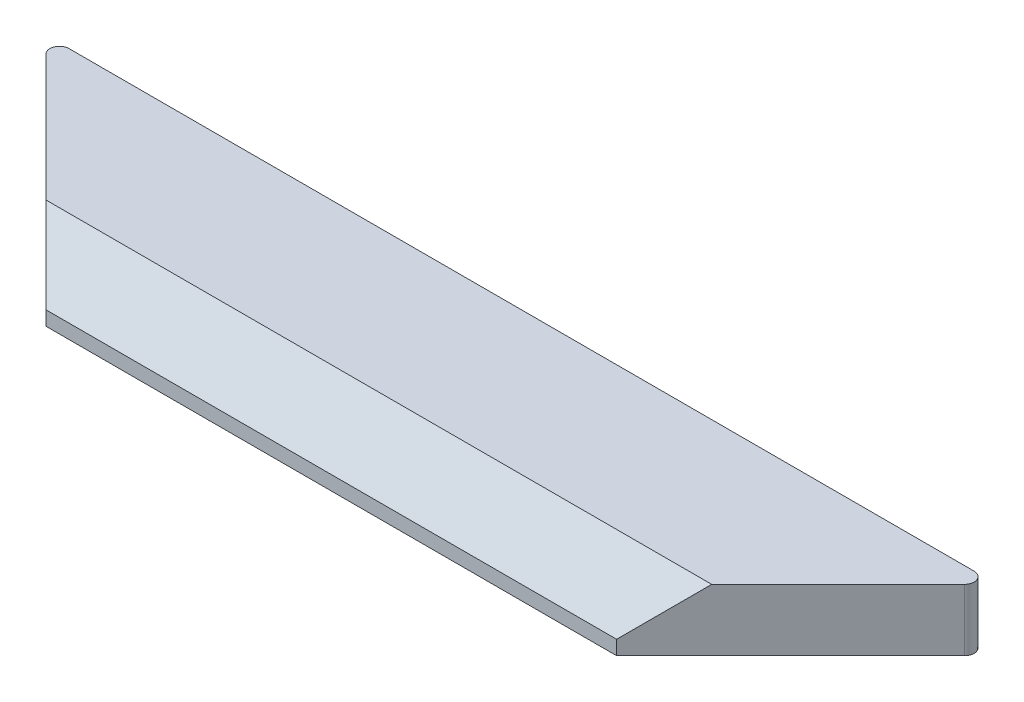
ISO-10303-21;
HEADER;
FILE_DESCRIPTION(('STEP AP214'),'2;1');
FILE_NAME('part.step','',(''),(''),'','','');
FILE_SCHEMA(('AUTOMOTIVE_DESIGN { 1 0 10303 214 1 1 1 1 }'));
ENDSEC;
DATA;
#1=APPLICATION_CONTEXT('core data for automotive mechanical design processes');
#2=APPLICATION_PROTOCOL_DEFINITION('international standard','automotive_design',2000,#1);
#3=PRODUCT_CONTEXT('',#1,'mechanical');
#4=PRODUCT('Part','Part','',(#3));
#5=PRODUCT_RELATED_PRODUCT_CATEGORY('part','',(#4));
#6=PRODUCT_DEFINITION_FORMATION('','',#4);
#7=PRODUCT_DEFINITION_CONTEXT('part definition',#1,'design');
#8=PRODUCT_DEFINITION('design','',#6,#7);
#9=PRODUCT_DEFINITION_SHAPE('','',#8);
#10=(LENGTH_UNIT() NAMED_UNIT(*) SI_UNIT(.MILLI.,.METRE.));
#11=(NAMED_UNIT(*) PLANE_ANGLE_UNIT() SI_UNIT($,.RADIAN.));
#12=(NAMED_UNIT(*) SI_UNIT($,.STERADIAN.) SOLID_ANGLE_UNIT());
#13=UNCERTAINTY_MEASURE_WITH_UNIT(LENGTH_MEASURE(1.E-05),#10,'distance_accuracy_value','');
#14=(GEOMETRIC_REPRESENTATION_CONTEXT(3) GLOBAL_UNCERTAINTY_ASSIGNED_CONTEXT((#13)) GLOBAL_UNIT_ASSIGNED_CONTEXT((#10,
#11,#12)) REPRESENTATION_CONTEXT('',''));
#15=CARTESIAN_POINT('',(0.,0.,0.));
#16=DIRECTION('',(0.,0.,1.));
#17=DIRECTION('',(1.,0.,0.));
#18=AXIS2_PLACEMENT_3D('',#15,#16,#17);
#19=CARTESIAN_POINT('',(50.,3.25,-10.));
#20=DIRECTION('',(-0.707106781186548,0.,-0.707106781186546));
#21=DIRECTION('',(-0.707106781186547,0.,0.707106781186549));
#22=AXIS2_PLACEMENT_3D('',#19,#20,#21);
#23=PLANE('',#22);
#24=DIRECTION('',(0.707106781186546,0.,-0.707106781186549));
#25=VECTOR('',#24,1.);
#26=CARTESIAN_POINT('',(50.,-3.25,-10.));
#27=LINE('',#26,#25);
#28=CARTESIAN_POINT('',(30.0000000000001,-3.25,10.));
#29=VERTEX_POINT('',#28);
#30=CARTESIAN_POINT('',(48.2928932188135,-3.25,-8.29289321881346));
#31=VERTEX_POINT('',#30);
#32=EDGE_CURVE('E180',#29,#31,#27,.T.);
#33=ORIENTED_EDGE('',*,*,#32,.T.);
#34=DIRECTION('',(0.,-1.,0.));
#35=VECTOR('',#34,1.);
#36=CARTESIAN_POINT('',(48.2928932188135,3.25,-8.29289321881346));
#37=LINE('',#36,#35);
#38=CARTESIAN_POINT('',(48.2928932188135,3.25,-8.29289321881346));
#39=VERTEX_POINT('',#38);
#40=EDGE_CURVE('E57',#31,#39,#37,.F.);
#41=ORIENTED_EDGE('',*,*,#40,.T.);
#42=DIRECTION('',(0.707106781186546,0.,-0.707106781186549));
#43=VECTOR('',#42,1.);
#44=CARTESIAN_POINT('',(50.,3.25,-10.));
#45=LINE('',#44,#43);
#46=CARTESIAN_POINT('',(35.,3.25,5.));
#47=VERTEX_POINT('',#46);
#48=EDGE_CURVE('E182',#47,#39,#45,.T.);
#49=ORIENTED_EDGE('',*,*,#48,.F.);
#50=DIRECTION('',(-0.577350269189624,-0.577350269189628,0.577350269189626));
#51=VECTOR('',#50,1.);
#52=CARTESIAN_POINT('',(23.3333333333334,-8.41666666666668,16.6666666666666));
#53=LINE('',#52,#51);
#54=CARTESIAN_POINT('',(30.0000000000001,-1.75000000000002,10.));
#55=VERTEX_POINT('',#54);
#56=EDGE_CURVE('E204',#47,#55,#53,.T.);
#57=ORIENTED_EDGE('',*,*,#56,.T.);
#58=DIRECTION('',(0.,-1.,0.));
#59=VECTOR('',#58,1.);
#60=CARTESIAN_POINT('',(30.0000000000001,3.25,10.));
#61=LINE('',#60,#59);
#62=EDGE_CURVE('E176',#55,#29,#61,.T.);
#63=ORIENTED_EDGE('',*,*,#62,.T.);
#64=EDGE_LOOP('',(#33,#41,#49,#57,#63));
#65=FACE_BOUND('',#64,.T.);
#66=ADVANCED_FACE('F41',(#65),#23,.F.);
#67=CARTESIAN_POINT('',(-50.,3.25,-10.));
#68=DIRECTION('',(0.,0.,1.));
#69=DIRECTION('',(1.,0.,0.));
#70=AXIS2_PLACEMENT_3D('',#67,#68,#69);
#71=PLANE('',#70);
#72=DIRECTION('',(-1.,0.,0.));
#73=VECTOR('',#72,1.);
#74=CARTESIAN_POINT('',(-50.,-3.25,-10.));
#75=LINE('',#74,#73);
#76=CARTESIAN_POINT('',(47.5857864376269,-3.25,-10.));
#77=VERTEX_POINT('',#76);
#78=CARTESIAN_POINT('',(31.,-3.25,-10.));
#79=VERTEX_POINT('',#78);
#80=EDGE_CURVE('E165',#77,#79,#75,.T.);
#81=ORIENTED_EDGE('',*,*,#80,.T.);
#82=DIRECTION('',(0.,-1.,0.));
#83=VECTOR('',#82,1.);
#84=CARTESIAN_POINT('',(31.,3.25,-10.));
#85=LINE('',#84,#83);
#86=CARTESIAN_POINT('',(31.,0.75,-10.));
#87=VERTEX_POINT('',#86);
#88=EDGE_CURVE('E262',#79,#87,#85,.F.);
#89=ORIENTED_EDGE('',*,*,#88,.T.);
#90=DIRECTION('',(1.,0.,0.));
#91=VECTOR('',#90,1.);
#92=CARTESIAN_POINT('',(30.,0.75,-10.));
#93=LINE('',#92,#91);
#94=CARTESIAN_POINT('',(-31.,0.75,-10.));
#95=VERTEX_POINT('',#94);
#96=EDGE_CURVE('E289',#95,#87,#93,.T.);
#97=ORIENTED_EDGE('',*,*,#96,.F.);
#98=DIRECTION('',(0.,-1.,0.));
#99=VECTOR('',#98,1.);
#100=CARTESIAN_POINT('',(-31.,3.25,-10.));
#101=LINE('',#100,#99);
#102=CARTESIAN_POINT('',(-31.,-3.25,-10.));
#103=VERTEX_POINT('',#102);
#104=EDGE_CURVE('E258',#95,#103,#101,.T.);
#105=ORIENTED_EDGE('',*,*,#104,.T.);
#106=CARTESIAN_POINT('',(-47.5857864376269,-3.25,-10.));
#107=VERTEX_POINT('',#106);
#108=EDGE_CURVE('E309',#103,#107,#75,.T.);
#109=ORIENTED_EDGE('',*,*,#108,.T.);
#110=DIRECTION('',(0.,-1.,0.));
#111=VECTOR('',#110,1.);
#112=CARTESIAN_POINT('',(-47.5857864376269,3.25,-10.));
#113=LINE('',#112,#111);
#114=CARTESIAN_POINT('',(-47.5857864376269,3.25,-10.));
#115=VERTEX_POINT('',#114);
#116=EDGE_CURVE('E255',#107,#115,#113,.F.);
#117=ORIENTED_EDGE('',*,*,#116,.T.);
#118=DIRECTION('',(-1.,0.,0.));
#119=VECTOR('',#118,1.);
#120=CARTESIAN_POINT('',(-50.,3.25,-10.));
#121=LINE('',#120,#119);
#122=CARTESIAN_POINT('',(47.5857864376269,3.25,-10.));
#123=VERTEX_POINT('',#122);
#124=EDGE_CURVE('E185',#123,#115,#121,.T.);
#125=ORIENTED_EDGE('',*,*,#124,.F.);
#126=DIRECTION('',(0.,-1.,0.));
#127=VECTOR('',#126,1.);
#128=CARTESIAN_POINT('',(47.5857864376269,3.25,-10.));
#129=LINE('',#128,#127);
#130=EDGE_CURVE('E251',#123,#77,#129,.T.);
#131=ORIENTED_EDGE('',*,*,#130,.T.);
#132=EDGE_LOOP('',(#81,#89,#97,#105,#109,#117,#125,#131));
#133=FACE_BOUND('',#132,.T.);
#134=ADVANCED_FACE('F305',(#133),#71,.F.);
#135=CARTESIAN_POINT('',(-50.,3.25,-10.));
#136=DIRECTION('',(0.707106781186549,0.,-0.707106781186546));
#137=DIRECTION('',(-0.707106781186546,0.,-0.707106781186549));
#138=AXIS2_PLACEMENT_3D('',#135,#136,#137);
#139=PLANE('',#138);
#140=DIRECTION('',(0.707106781186546,0.,0.707106781186549));
#141=VECTOR('',#140,1.);
#142=CARTESIAN_POINT('',(-50.,3.25,-10.));
#143=LINE('',#142,#141);
#144=CARTESIAN_POINT('',(-48.2928932188135,3.25,-8.29289321881346));
#145=VERTEX_POINT('',#144);
#146=CARTESIAN_POINT('',(-35.,3.25,5.));
#147=VERTEX_POINT('',#146);
#148=EDGE_CURVE('E190',#145,#147,#143,.T.);
#149=ORIENTED_EDGE('',*,*,#148,.F.);
#150=DIRECTION('',(0.,-1.,0.));
#151=VECTOR('',#150,1.);
#152=CARTESIAN_POINT('',(-48.2928932188135,3.25,-8.29289321881346));
#153=LINE('',#152,#151);
#154=CARTESIAN_POINT('',(-48.2928932188135,-3.25,-8.29289321881346));
#155=VERTEX_POINT('',#154);
#156=EDGE_CURVE('E160',#145,#155,#153,.T.);
#157=ORIENTED_EDGE('',*,*,#156,.T.);
#158=DIRECTION('',(0.707106781186546,0.,0.707106781186549));
#159=VECTOR('',#158,1.);
#160=CARTESIAN_POINT('',(-50.,-3.25,-10.));
#161=LINE('',#160,#159);
#162=CARTESIAN_POINT('',(-30.0000000000001,-3.25,10.));
#163=VERTEX_POINT('',#162);
#164=EDGE_CURVE('E153',#155,#163,#161,.T.);
#165=ORIENTED_EDGE('',*,*,#164,.T.);
#166=DIRECTION('',(0.,-1.,0.));
#167=VECTOR('',#166,1.);
#168=CARTESIAN_POINT('',(-30.0000000000001,3.25,10.));
#169=LINE('',#168,#167);
#170=CARTESIAN_POINT('',(-30.0000000000001,-1.75000000000002,10.));
#171=VERTEX_POINT('',#170);
#172=EDGE_CURVE('E157',#171,#163,#169,.T.);
#173=ORIENTED_EDGE('',*,*,#172,.F.);
#174=DIRECTION('',(-0.577350269189624,0.577350269189628,-0.577350269189626));
#175=VECTOR('',#174,1.);
#176=CARTESIAN_POINT('',(-23.3333333333334,-8.41666666666668,16.6666666666666));
#177=LINE('',#176,#175);
#178=EDGE_CURVE('E209',#171,#147,#177,.T.);
#179=ORIENTED_EDGE('',*,*,#178,.T.);
#180=EDGE_LOOP('',(#149,#157,#165,#173,#179));
#181=FACE_BOUND('',#180,.T.);
#182=ADVANCED_FACE('F155',(#181),#139,.F.);
#183=CARTESIAN_POINT('',(-30.0000000000001,3.25,10.));
#184=DIRECTION('',(0.,0.,-1.));
#185=DIRECTION('',(-1.,0.,0.));
#186=AXIS2_PLACEMENT_3D('',#183,#184,#185);
#187=PLANE('',#186);
#188=ORIENTED_EDGE('',*,*,#62,.F.);
#189=DIRECTION('',(-1.,0.,0.));
#190=VECTOR('',#189,1.);
#191=CARTESIAN_POINT('',(-30.0000000000001,-1.75000000000002,10.));
#192=LINE('',#191,#190);
#193=EDGE_CURVE('E173',#55,#171,#192,.T.);
#194=ORIENTED_EDGE('',*,*,#193,.T.);
#195=ORIENTED_EDGE('',*,*,#172,.T.);
#196=DIRECTION('',(1.,0.,0.));
#197=VECTOR('',#196,1.);
#198=CARTESIAN_POINT('',(-30.0000000000001,-3.25,10.));
#199=LINE('',#198,#197);
#200=EDGE_CURVE('E164',#163,#29,#199,.T.);
#201=ORIENTED_EDGE('',*,*,#200,.T.);
#202=EDGE_LOOP('',(#188,#194,#195,#201));
#203=FACE_BOUND('',#202,.T.);
#204=ADVANCED_FACE('F170',(#203),#187,.F.);
#205=CARTESIAN_POINT('',(0.,3.25,0.));
#206=DIRECTION('',(0.,1.,0.));
#207=DIRECTION('',(0.,0.,1.));
#208=AXIS2_PLACEMENT_3D('',#205,#206,#207);
#209=PLANE('',#208);
#210=ORIENTED_EDGE('',*,*,#124,.T.);
#211=CARTESIAN_POINT('',(-47.5857864376269,3.25,-9.));
#212=DIRECTION('',(0.,1.,0.));
#213=DIRECTION('',(0.,0.,1.));
#214=AXIS2_PLACEMENT_3D('',#211,#212,#213);
#215=CIRCLE('',#214,1.);
#216=EDGE_CURVE('E65',#115,#145,#215,.T.);
#217=ORIENTED_EDGE('',*,*,#216,.T.);
#218=ORIENTED_EDGE('',*,*,#148,.T.);
#219=DIRECTION('',(1.,0.,0.));
#220=VECTOR('',#219,1.);
#221=CARTESIAN_POINT('',(30.0000000000001,3.25,5.));
#222=LINE('',#221,#220);
#223=EDGE_CURVE('E175',#147,#47,#222,.T.);
#224=ORIENTED_EDGE('',*,*,#223,.T.);
#225=ORIENTED_EDGE('',*,*,#48,.T.);
#226=CARTESIAN_POINT('',(47.5857864376269,3.25,-9.));
#227=DIRECTION('',(0.,1.,0.));
#228=DIRECTION('',(0.,0.,1.));
#229=AXIS2_PLACEMENT_3D('',#226,#227,#228);
#230=CIRCLE('',#229,1.);
#231=EDGE_CURVE('E268',#39,#123,#230,.T.);
#232=ORIENTED_EDGE('',*,*,#231,.T.);
#233=EDGE_LOOP('',(#210,#217,#218,#224,#225,#232));
#234=FACE_BOUND('',#233,.T.);
#235=ADVANCED_FACE('F349',(#234),#209,.T.);
#236=CARTESIAN_POINT('',(0.,-3.25,0.));
#237=DIRECTION('',(0.,1.,0.));
#238=DIRECTION('',(0.,0.,1.));
#239=AXIS2_PLACEMENT_3D('',#236,#237,#238);
#240=PLANE('',#239);
#241=DIRECTION('',(0.,0.,1.));
#242=VECTOR('',#241,1.);
#243=CARTESIAN_POINT('',(30.,-3.25,0.));
#244=LINE('',#243,#242);
#245=CARTESIAN_POINT('',(30.,-3.25,-9.));
#246=VERTEX_POINT('',#245);
#247=CARTESIAN_POINT('',(30.,-3.25,-1.));
#248=VERTEX_POINT('',#247);
#249=EDGE_CURVE('E303',#246,#248,#244,.T.);
#250=ORIENTED_EDGE('',*,*,#249,.F.);
#251=CARTESIAN_POINT('',(31.,-3.25,-9.));
#252=DIRECTION('',(0.,1.,0.));
#253=DIRECTION('',(0.,0.,1.));
#254=AXIS2_PLACEMENT_3D('',#251,#252,#253);
#255=CIRCLE('',#254,1.);
#256=EDGE_CURVE('E248',#246,#79,#255,.F.);
#257=ORIENTED_EDGE('',*,*,#256,.T.);
#258=ORIENTED_EDGE('',*,*,#80,.F.);
#259=CARTESIAN_POINT('',(47.5857864376269,-3.25,-9.));
#260=DIRECTION('',(0.,1.,0.));
#261=DIRECTION('',(0.,0.,1.));
#262=AXIS2_PLACEMENT_3D('',#259,#260,#261);
#263=CIRCLE('',#262,1.);
#264=EDGE_CURVE('E239',#77,#31,#263,.F.);
#265=ORIENTED_EDGE('',*,*,#264,.T.);
#266=ORIENTED_EDGE('',*,*,#32,.F.);
#267=ORIENTED_EDGE('',*,*,#200,.F.);
#268=ORIENTED_EDGE('',*,*,#164,.F.);
#269=CARTESIAN_POINT('',(-47.5857864376269,-3.25,-9.));
#270=DIRECTION('',(0.,1.,0.));
#271=DIRECTION('',(0.,0.,1.));
#272=AXIS2_PLACEMENT_3D('',#269,#270,#271);
#273=CIRCLE('',#272,1.);
#274=EDGE_CURVE('E242',#155,#107,#273,.F.);
#275=ORIENTED_EDGE('',*,*,#274,.T.);
#276=ORIENTED_EDGE('',*,*,#108,.F.);
#277=CARTESIAN_POINT('',(-31.,-3.25,-9.));
#278=DIRECTION('',(0.,1.,0.));
#279=DIRECTION('',(0.,0.,1.));
#280=AXIS2_PLACEMENT_3D('',#277,#278,#279);
#281=CIRCLE('',#280,1.);
#282=CARTESIAN_POINT('',(-30.,-3.25,-9.));
#283=VERTEX_POINT('',#282);
#284=EDGE_CURVE('E245',#103,#283,#281,.F.);
#285=ORIENTED_EDGE('',*,*,#284,.T.);
#286=DIRECTION('',(0.,0.,-1.));
#287=VECTOR('',#286,1.);
#288=CARTESIAN_POINT('',(-30.,-3.25,0.));
#289=LINE('',#288,#287);
#290=CARTESIAN_POINT('',(-30.,-3.25,-1.00000000000001));
#291=VERTEX_POINT('',#290);
#292=EDGE_CURVE('E196',#291,#283,#289,.T.);
#293=ORIENTED_EDGE('',*,*,#292,.F.);
#294=CARTESIAN_POINT('',(-29.,-3.25,-1.00000000000001));
#295=DIRECTION('',(0.,1.,0.));
#296=DIRECTION('',(0.,0.,1.));
#297=AXIS2_PLACEMENT_3D('',#294,#295,#296);
#298=CIRCLE('',#297,1.);
#299=CARTESIAN_POINT('',(-29.,-3.25,0.));
#300=VERTEX_POINT('',#299);
#301=EDGE_CURVE('E275',#291,#300,#298,.T.);
#302=ORIENTED_EDGE('',*,*,#301,.T.);
#303=DIRECTION('',(-1.,0.,0.));
#304=VECTOR('',#303,1.);
#305=CARTESIAN_POINT('',(30.,-3.25,0.));
#306=LINE('',#305,#304);
#307=CARTESIAN_POINT('',(29.,-3.25,0.));
#308=VERTEX_POINT('',#307);
#309=EDGE_CURVE('E319',#308,#300,#306,.T.);
#310=ORIENTED_EDGE('',*,*,#309,.F.);
#311=CARTESIAN_POINT('',(29.,-3.25,-1.));
#312=DIRECTION('',(0.,1.,0.));
#313=DIRECTION('',(0.,0.,1.));
#314=AXIS2_PLACEMENT_3D('',#311,#312,#313);
#315=CIRCLE('',#314,1.);
#316=EDGE_CURVE('E278',#308,#248,#315,.T.);
#317=ORIENTED_EDGE('',*,*,#316,.T.);
#318=EDGE_LOOP('',(#250,#257,#258,#265,#266,#267,#268,#275,#276,#285,#293,#302,#310,#317));
#319=FACE_BOUND('',#318,.T.);
#320=ADVANCED_FACE('F179',(#319),#240,.F.);
#321=CARTESIAN_POINT('',(-30.,0.75,0.));
#322=DIRECTION('',(-1.,0.,0.));
#323=DIRECTION('',(0.,0.,1.));
#324=AXIS2_PLACEMENT_3D('',#321,#322,#323);
#325=PLANE('',#324);
#326=CARTESIAN_POINT('',(-30.,-1.25,-5.));
#327=DIRECTION('',(-1.,0.,0.));
#328=DIRECTION('',(0.,0.,1.));
#329=AXIS2_PLACEMENT_3D('',#326,#327,#328);
#330=CIRCLE('',#329,1.);
#331=CARTESIAN_POINT('',(-30.,-1.25,-4.));
#332=VERTEX_POINT('',#331);
#333=EDGE_CURVE('E192',#332,#332,#330,.F.);
#334=ORIENTED_EDGE('',*,*,#333,.F.);
#335=EDGE_LOOP('',(#334));
#336=FACE_BOUND('',#335,.T.);
#337=DIRECTION('',(0.,0.,-1.));
#338=VECTOR('',#337,1.);
#339=CARTESIAN_POINT('',(-30.,0.75,0.));
#340=LINE('',#339,#338);
#341=CARTESIAN_POINT('',(-30.,0.75,-1.00000000000001));
#342=VERTEX_POINT('',#341);
#343=CARTESIAN_POINT('',(-30.,0.75,-9.));
#344=VERTEX_POINT('',#343);
#345=EDGE_CURVE('E323',#342,#344,#340,.T.);
#346=ORIENTED_EDGE('',*,*,#345,.F.);
#347=DIRECTION('',(0.,-1.,0.));
#348=VECTOR('',#347,1.);
#349=CARTESIAN_POINT('',(-30.,-3.25,-1.00000000000001));
#350=LINE('',#349,#348);
#351=EDGE_CURVE('E215',#342,#291,#350,.T.);
#352=ORIENTED_EDGE('',*,*,#351,.T.);
#353=ORIENTED_EDGE('',*,*,#292,.T.);
#354=DIRECTION('',(0.,-1.,0.));
#355=VECTOR('',#354,1.);
#356=CARTESIAN_POINT('',(-30.,0.75,-9.));
#357=LINE('',#356,#355);
#358=EDGE_CURVE('E212',#283,#344,#357,.F.);
#359=ORIENTED_EDGE('',*,*,#358,.T.);
#360=EDGE_LOOP('',(#346,#352,#353,#359));
#361=FACE_BOUND('',#360,.T.);
#362=ADVANCED_FACE('F382',(#336,#361),#325,.F.);
#363=CARTESIAN_POINT('',(30.,0.75,0.));
#364=DIRECTION('',(0.,0.,1.));
#365=DIRECTION('',(1.,0.,0.));
#366=AXIS2_PLACEMENT_3D('',#363,#364,#365);
#367=PLANE('',#366);
#368=ORIENTED_EDGE('',*,*,#309,.T.);
#369=DIRECTION('',(0.,-1.,0.));
#370=VECTOR('',#369,1.);
#371=CARTESIAN_POINT('',(-29.,0.75,0.));
#372=LINE('',#371,#370);
#373=CARTESIAN_POINT('',(-29.,0.75,0.));
#374=VERTEX_POINT('',#373);
#375=EDGE_CURVE('E223',#300,#374,#372,.F.);
#376=ORIENTED_EDGE('',*,*,#375,.T.);
#377=DIRECTION('',(-1.,0.,0.));
#378=VECTOR('',#377,1.);
#379=CARTESIAN_POINT('',(30.,0.75,0.));
#380=LINE('',#379,#378);
#381=CARTESIAN_POINT('',(29.,0.75,0.));
#382=VERTEX_POINT('',#381);
#383=EDGE_CURVE('E298',#382,#374,#380,.T.);
#384=ORIENTED_EDGE('',*,*,#383,.F.);
#385=DIRECTION('',(0.,-1.,0.));
#386=VECTOR('',#385,1.);
#387=CARTESIAN_POINT('',(29.,-3.25,0.));
#388=LINE('',#387,#386);
#389=EDGE_CURVE('E219',#382,#308,#388,.T.);
#390=ORIENTED_EDGE('',*,*,#389,.T.);
#391=EDGE_LOOP('',(#368,#376,#384,#390));
#392=FACE_BOUND('',#391,.T.);
#393=ADVANCED_FACE('F387',(#392),#367,.F.);
#394=CARTESIAN_POINT('',(30.,0.75,0.));
#395=DIRECTION('',(1.,0.,0.));
#396=DIRECTION('',(0.,0.,-1.));
#397=AXIS2_PLACEMENT_3D('',#394,#395,#396);
#398=PLANE('',#397);
#399=CARTESIAN_POINT('',(30.,-1.25,-5.));
#400=DIRECTION('',(1.,0.,0.));
#401=DIRECTION('',(0.,0.,-1.));
#402=AXIS2_PLACEMENT_3D('',#399,#400,#401);
#403=CIRCLE('',#402,1.);
#404=CARTESIAN_POINT('',(30.,-1.25,-6.));
#405=VERTEX_POINT('',#404);
#406=EDGE_CURVE('E197',#405,#405,#403,.T.);
#407=ORIENTED_EDGE('',*,*,#406,.T.);
#408=EDGE_LOOP('',(#407));
#409=FACE_BOUND('',#408,.T.);
#410=ORIENTED_EDGE('',*,*,#249,.T.);
#411=DIRECTION('',(0.,-1.,0.));
#412=VECTOR('',#411,1.);
#413=CARTESIAN_POINT('',(30.,0.75,-1.));
#414=LINE('',#413,#412);
#415=CARTESIAN_POINT('',(30.,0.75,-1.));
#416=VERTEX_POINT('',#415);
#417=EDGE_CURVE('E236',#248,#416,#414,.F.);
#418=ORIENTED_EDGE('',*,*,#417,.T.);
#419=DIRECTION('',(0.,0.,1.));
#420=VECTOR('',#419,1.);
#421=CARTESIAN_POINT('',(30.,0.75,0.));
#422=LINE('',#421,#420);
#423=CARTESIAN_POINT('',(30.,0.75,-9.));
#424=VERTEX_POINT('',#423);
#425=EDGE_CURVE('E287',#424,#416,#422,.T.);
#426=ORIENTED_EDGE('',*,*,#425,.F.);
#427=DIRECTION('',(0.,-1.,0.));
#428=VECTOR('',#427,1.);
#429=CARTESIAN_POINT('',(30.,0.75,-9.));
#430=LINE('',#429,#428);
#431=EDGE_CURVE('E232',#424,#246,#430,.T.);
#432=ORIENTED_EDGE('',*,*,#431,.T.);
#433=EDGE_LOOP('',(#410,#418,#426,#432));
#434=FACE_BOUND('',#433,.T.);
#435=ADVANCED_FACE('F295',(#409,#434),#398,.F.);
#436=CARTESIAN_POINT('',(0.,0.75,0.));
#437=DIRECTION('',(0.,1.,0.));
#438=DIRECTION('',(0.,0.,1.));
#439=AXIS2_PLACEMENT_3D('',#436,#437,#438);
#440=PLANE('',#439);
#441=ORIENTED_EDGE('',*,*,#383,.T.);
#442=CARTESIAN_POINT('',(-29.,0.75,-1.00000000000001));
#443=DIRECTION('',(0.,1.,0.));
#444=DIRECTION('',(0.,0.,1.));
#445=AXIS2_PLACEMENT_3D('',#442,#443,#444);
#446=CIRCLE('',#445,1.);
#447=EDGE_CURVE('E229',#374,#342,#446,.F.);
#448=ORIENTED_EDGE('',*,*,#447,.T.);
#449=ORIENTED_EDGE('',*,*,#345,.T.);
#450=CARTESIAN_POINT('',(-31.,0.75,-9.));
#451=DIRECTION('',(0.,1.,0.));
#452=DIRECTION('',(0.,0.,1.));
#453=AXIS2_PLACEMENT_3D('',#450,#451,#452);
#454=CIRCLE('',#453,1.);
#455=EDGE_CURVE('E11',#344,#95,#454,.T.);
#456=ORIENTED_EDGE('',*,*,#455,.T.);
#457=ORIENTED_EDGE('',*,*,#96,.T.);
#458=CARTESIAN_POINT('',(31.,0.75,-9.));
#459=DIRECTION('',(0.,1.,0.));
#460=DIRECTION('',(0.,0.,1.));
#461=AXIS2_PLACEMENT_3D('',#458,#459,#460);
#462=CIRCLE('',#461,1.);
#463=EDGE_CURVE('E50',#87,#424,#462,.T.);
#464=ORIENTED_EDGE('',*,*,#463,.T.);
#465=ORIENTED_EDGE('',*,*,#425,.T.);
#466=CARTESIAN_POINT('',(29.,0.75,-1.));
#467=DIRECTION('',(0.,1.,0.));
#468=DIRECTION('',(0.,0.,1.));
#469=AXIS2_PLACEMENT_3D('',#466,#467,#468);
#470=CIRCLE('',#469,1.);
#471=EDGE_CURVE('E226',#416,#382,#470,.F.);
#472=ORIENTED_EDGE('',*,*,#471,.T.);
#473=EDGE_LOOP('',(#441,#448,#449,#456,#457,#464,#465,#472));
#474=FACE_BOUND('',#473,.T.);
#475=ADVANCED_FACE('F286',(#474),#440,.F.);
#476=CARTESIAN_POINT('',(-30.,-1.25,-5.));
#477=DIRECTION('',(0.,1.,0.));
#478=DIRECTION('',(0.,0.,-1.));
#479=AXIS2_PLACEMENT_3D('',#476,#477,#478);
#480=SPHERICAL_SURFACE('',#479,1.);
#481=CARTESIAN_POINT('',(-30.,-1.25,-5.));
#482=DIRECTION('',(-1.,0.,0.));
#483=DIRECTION('',(0.,0.,1.));
#484=AXIS2_PLACEMENT_3D('',#481,#482,#483);
#485=SPHERICAL_SURFACE('',#484,1.);
#486=ORIENTED_EDGE('',*,*,#333,.T.);
#487=EDGE_LOOP('',(#486));
#488=FACE_BOUND('',#487,.T.);
#489=ADVANCED_FACE('F366',(#488),#485,.F.);
#490=CARTESIAN_POINT('',(30.,-1.25,-5.));
#491=DIRECTION('',(0.,1.,0.));
#492=DIRECTION('',(0.,0.,-1.));
#493=AXIS2_PLACEMENT_3D('',#490,#491,#492);
#494=SPHERICAL_SURFACE('',#493,1.);
#495=CARTESIAN_POINT('',(30.,-1.25,-5.));
#496=DIRECTION('',(1.,0.,0.));
#497=DIRECTION('',(0.,0.,-1.));
#498=AXIS2_PLACEMENT_3D('',#495,#496,#497);
#499=SPHERICAL_SURFACE('',#498,1.);
#500=ORIENTED_EDGE('',*,*,#406,.F.);
#501=EDGE_LOOP('',(#500));
#502=FACE_BOUND('',#501,.T.);
#503=ADVANCED_FACE('F357',(#502),#499,.F.);
#504=CARTESIAN_POINT('',(0.,3.25,5.));
#505=DIRECTION('',(0.,0.707106781186546,0.707106781186549));
#506=DIRECTION('',(-1.,0.,0.));
#507=AXIS2_PLACEMENT_3D('',#504,#505,#506);
#508=PLANE('',#507);
#509=ORIENTED_EDGE('',*,*,#178,.F.);
#510=ORIENTED_EDGE('',*,*,#193,.F.);
#511=ORIENTED_EDGE('',*,*,#56,.F.);
#512=ORIENTED_EDGE('',*,*,#223,.F.);
#513=EDGE_LOOP('',(#509,#510,#511,#512));
#514=FACE_BOUND('',#513,.T.);
#515=ADVANCED_FACE('F353',(#514),#508,.T.);
#516=CARTESIAN_POINT('',(-29.,0.75,-1.00000000000001));
#517=DIRECTION('',(0.,1.,0.));
#518=DIRECTION('',(0.,0.,1.));
#519=AXIS2_PLACEMENT_3D('',#516,#517,#518);
#520=CYLINDRICAL_SURFACE('',#519,1.);
#521=ORIENTED_EDGE('',*,*,#447,.F.);
#522=ORIENTED_EDGE('',*,*,#375,.F.);
#523=ORIENTED_EDGE('',*,*,#301,.F.);
#524=ORIENTED_EDGE('',*,*,#351,.F.);
#525=EDGE_LOOP('',(#521,#522,#523,#524));
#526=FACE_BOUND('',#525,.T.);
#527=ADVANCED_FACE('F356',(#526),#520,.F.);
#528=CARTESIAN_POINT('',(29.,0.75,-1.));
#529=DIRECTION('',(0.,1.,0.));
#530=DIRECTION('',(0.,0.,1.));
#531=AXIS2_PLACEMENT_3D('',#528,#529,#530);
#532=CYLINDRICAL_SURFACE('',#531,1.);
#533=ORIENTED_EDGE('',*,*,#471,.F.);
#534=ORIENTED_EDGE('',*,*,#417,.F.);
#535=ORIENTED_EDGE('',*,*,#316,.F.);
#536=ORIENTED_EDGE('',*,*,#389,.F.);
#537=EDGE_LOOP('',(#533,#534,#535,#536));
#538=FACE_BOUND('',#537,.T.);
#539=ADVANCED_FACE('F363',(#538),#532,.F.);
#540=CARTESIAN_POINT('',(31.,0.75,-9.));
#541=DIRECTION('',(0.,-1.,0.));
#542=DIRECTION('',(0.,0.,-1.));
#543=AXIS2_PLACEMENT_3D('',#540,#541,#542);
#544=CYLINDRICAL_SURFACE('',#543,1.);
#545=ORIENTED_EDGE('',*,*,#463,.F.);
#546=ORIENTED_EDGE('',*,*,#88,.F.);
#547=ORIENTED_EDGE('',*,*,#256,.F.);
#548=ORIENTED_EDGE('',*,*,#431,.F.);
#549=EDGE_LOOP('',(#545,#546,#547,#548));
#550=FACE_BOUND('',#549,.T.);
#551=ADVANCED_FACE('F300',(#550),#544,.T.);
#552=CARTESIAN_POINT('',(-31.,3.25,-9.));
#553=DIRECTION('',(0.,-1.,0.));
#554=DIRECTION('',(0.,0.,-1.));
#555=AXIS2_PLACEMENT_3D('',#552,#553,#554);
#556=CYLINDRICAL_SURFACE('',#555,1.);
#557=ORIENTED_EDGE('',*,*,#455,.F.);
#558=ORIENTED_EDGE('',*,*,#358,.F.);
#559=ORIENTED_EDGE('',*,*,#284,.F.);
#560=ORIENTED_EDGE('',*,*,#104,.F.);
#561=EDGE_LOOP('',(#557,#558,#559,#560));
#562=FACE_BOUND('',#561,.T.);
#563=ADVANCED_FACE('F343',(#562),#556,.T.);
#564=CARTESIAN_POINT('',(-47.5857864376269,3.25,-9.));
#565=DIRECTION('',(0.,-1.,0.));
#566=DIRECTION('',(0.,0.,-1.));
#567=AXIS2_PLACEMENT_3D('',#564,#565,#566);
#568=CYLINDRICAL_SURFACE('',#567,1.);
#569=ORIENTED_EDGE('',*,*,#216,.F.);
#570=ORIENTED_EDGE('',*,*,#116,.F.);
#571=ORIENTED_EDGE('',*,*,#274,.F.);
#572=ORIENTED_EDGE('',*,*,#156,.F.);
#573=EDGE_LOOP('',(#569,#570,#571,#572));
#574=FACE_BOUND('',#573,.T.);
#575=ADVANCED_FACE('F348',(#574),#568,.T.);
#576=CARTESIAN_POINT('',(47.5857864376269,3.25,-9.));
#577=DIRECTION('',(0.,-1.,0.));
#578=DIRECTION('',(0.,0.,-1.));
#579=AXIS2_PLACEMENT_3D('',#576,#577,#578);
#580=CYLINDRICAL_SURFACE('',#579,1.);
#581=ORIENTED_EDGE('',*,*,#231,.F.);
#582=ORIENTED_EDGE('',*,*,#40,.F.);
#583=ORIENTED_EDGE('',*,*,#264,.F.);
#584=ORIENTED_EDGE('',*,*,#130,.F.);
#585=EDGE_LOOP('',(#581,#582,#583,#584));
#586=FACE_BOUND('',#585,.T.);
#587=ADVANCED_FACE('F43',(#586),#580,.T.);
#588=CLOSED_SHELL('',(#66,#134,#182,#204,#235,#320,#362,#393,#435,#475,#489,#503,#515,#527,#539,
#551,#563,#575,#587));
#589=MANIFOLD_SOLID_BREP('B2',#588);
#590=ADVANCED_BREP_SHAPE_REPRESENTATION('',(#18,#589),#14);
#591=SHAPE_DEFINITION_REPRESENTATION(#9,#590);
ENDSEC;
END-ISO-10303-21;
